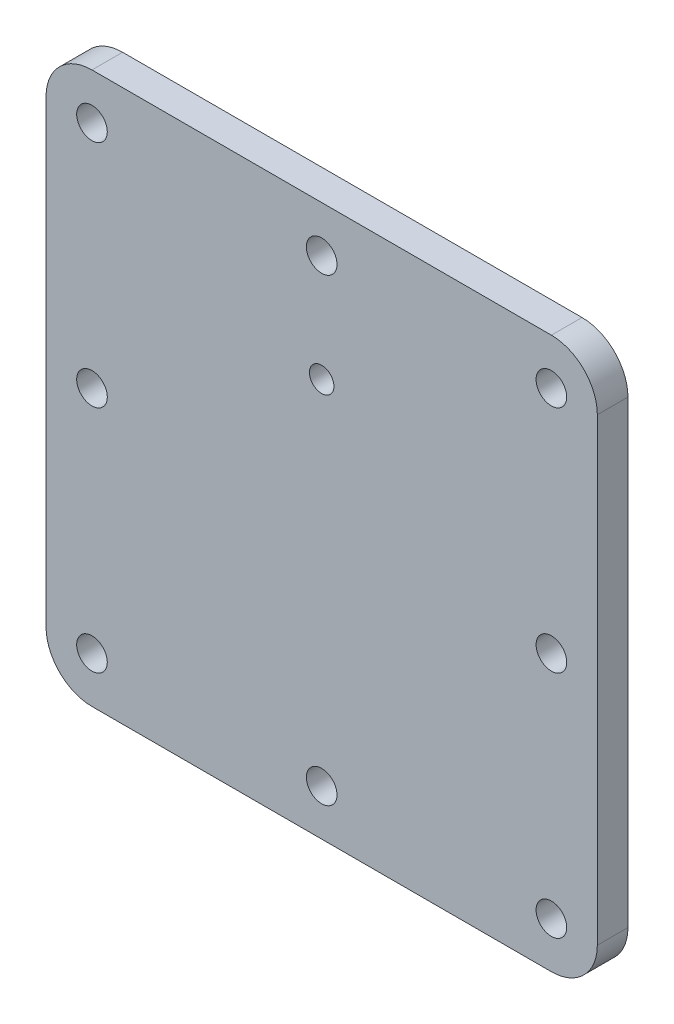
ISO-10303-21;
HEADER;
FILE_DESCRIPTION(('STEP AP214'),'2;1');
FILE_NAME('part.step','',(''),(''),'','','');
FILE_SCHEMA(('AUTOMOTIVE_DESIGN { 1 0 10303 214 1 1 1 1 }'));
ENDSEC;
DATA;
#1=APPLICATION_CONTEXT('core data for automotive mechanical design processes');
#2=APPLICATION_PROTOCOL_DEFINITION('international standard','automotive_design',2000,#1);
#3=PRODUCT_CONTEXT('',#1,'mechanical');
#4=PRODUCT('Part','Part','',(#3));
#5=PRODUCT_RELATED_PRODUCT_CATEGORY('part','',(#4));
#6=PRODUCT_DEFINITION_FORMATION('','',#4);
#7=PRODUCT_DEFINITION_CONTEXT('part definition',#1,'design');
#8=PRODUCT_DEFINITION('design','',#6,#7);
#9=PRODUCT_DEFINITION_SHAPE('','',#8);
#10=(LENGTH_UNIT() NAMED_UNIT(*) SI_UNIT(.MILLI.,.METRE.));
#11=(NAMED_UNIT(*) PLANE_ANGLE_UNIT() SI_UNIT($,.RADIAN.));
#12=(NAMED_UNIT(*) SI_UNIT($,.STERADIAN.) SOLID_ANGLE_UNIT());
#13=UNCERTAINTY_MEASURE_WITH_UNIT(LENGTH_MEASURE(1.E-05),#10,'distance_accuracy_value','');
#14=(GEOMETRIC_REPRESENTATION_CONTEXT(3) GLOBAL_UNCERTAINTY_ASSIGNED_CONTEXT((#13)) GLOBAL_UNIT_ASSIGNED_CONTEXT((#10,
#11,#12)) REPRESENTATION_CONTEXT('',''));
#15=CARTESIAN_POINT('',(0.,0.,0.));
#16=DIRECTION('',(0.,0.,1.));
#17=DIRECTION('',(1.,0.,0.));
#18=AXIS2_PLACEMENT_3D('',#15,#16,#17);
#19=CARTESIAN_POINT('',(-75.,-75.,10.));
#20=DIRECTION('',(0.,0.,1.));
#21=DIRECTION('',(1.,0.,0.));
#22=AXIS2_PLACEMENT_3D('',#19,#20,#21);
#23=PLANE('',#22);
#24=CARTESIAN_POINT('',(0.,40.,10.));
#25=DIRECTION('',(0.,0.,1.));
#26=DIRECTION('',(1.,0.,0.));
#27=AXIS2_PLACEMENT_3D('',#24,#25,#26);
#28=CIRCLE('',#27,4.);
#29=CARTESIAN_POINT('',(4.00000000000001,40.,10.));
#30=VERTEX_POINT('',#29);
#31=EDGE_CURVE('E227',#30,#30,#28,.T.);
#32=ORIENTED_EDGE('',*,*,#31,.F.);
#33=EDGE_LOOP('',(#32));
#34=FACE_BOUND('',#33,.T.);
#35=CARTESIAN_POINT('',(1.54341102686378E-12,-75.,10.));
#36=DIRECTION('',(0.,0.,1.));
#37=DIRECTION('',(1.,0.,0.));
#38=AXIS2_PLACEMENT_3D('',#35,#36,#37);
#39=CIRCLE('',#38,5.);
#40=CARTESIAN_POINT('',(5.00000000000154,-75.,10.));
#41=VERTEX_POINT('',#40);
#42=EDGE_CURVE('E212',#41,#41,#39,.T.);
#43=ORIENTED_EDGE('',*,*,#42,.F.);
#44=EDGE_LOOP('',(#43));
#45=FACE_BOUND('',#44,.T.);
#46=CARTESIAN_POINT('',(75.0000000000008,0.,10.));
#47=DIRECTION('',(0.,0.,1.));
#48=DIRECTION('',(1.,0.,0.));
#49=AXIS2_PLACEMENT_3D('',#46,#47,#48);
#50=CIRCLE('',#49,5.);
#51=CARTESIAN_POINT('',(80.0000000000008,0.,10.));
#52=VERTEX_POINT('',#51);
#53=EDGE_CURVE('E200',#52,#52,#50,.T.);
#54=ORIENTED_EDGE('',*,*,#53,.F.);
#55=EDGE_LOOP('',(#54));
#56=FACE_BOUND('',#55,.T.);
#57=CARTESIAN_POINT('',(75.,75.,10.));
#58=DIRECTION('',(0.,0.,1.));
#59=DIRECTION('',(1.,0.,0.));
#60=AXIS2_PLACEMENT_3D('',#57,#58,#59);
#61=CIRCLE('',#60,5.00000000000001);
#62=CARTESIAN_POINT('',(80.,75.,10.));
#63=VERTEX_POINT('',#62);
#64=EDGE_CURVE('E188',#63,#63,#61,.T.);
#65=ORIENTED_EDGE('',*,*,#64,.F.);
#66=EDGE_LOOP('',(#65));
#67=FACE_BOUND('',#66,.T.);
#68=CARTESIAN_POINT('',(-75.,75.,10.));
#69=DIRECTION('',(0.,0.,1.));
#70=DIRECTION('',(1.,0.,0.));
#71=AXIS2_PLACEMENT_3D('',#68,#69,#70);
#72=CIRCLE('',#71,5.00000000000001);
#73=CARTESIAN_POINT('',(-70.,75.,10.));
#74=VERTEX_POINT('',#73);
#75=EDGE_CURVE('E134',#74,#74,#72,.T.);
#76=ORIENTED_EDGE('',*,*,#75,.F.);
#77=EDGE_LOOP('',(#76));
#78=FACE_BOUND('',#77,.T.);
#79=CARTESIAN_POINT('',(-75.,-75.,10.));
#80=DIRECTION('',(0.,0.,1.));
#81=DIRECTION('',(1.,0.,0.));
#82=AXIS2_PLACEMENT_3D('',#79,#80,#81);
#83=CIRCLE('',#82,15.);
#84=CARTESIAN_POINT('',(-90.,-74.9999999999999,10.));
#85=VERTEX_POINT('',#84);
#86=CARTESIAN_POINT('',(-74.9999999999999,-90.,10.));
#87=VERTEX_POINT('',#86);
#88=EDGE_CURVE('E145',#85,#87,#83,.T.);
#89=ORIENTED_EDGE('',*,*,#88,.T.);
#90=DIRECTION('',(1.,0.,0.));
#91=VECTOR('',#90,1.);
#92=CARTESIAN_POINT('',(-74.9999999999999,-90.,10.));
#93=LINE('',#92,#91);
#94=CARTESIAN_POINT('',(75.,-89.9999999999992,10.));
#95=VERTEX_POINT('',#94);
#96=EDGE_CURVE('E93',#87,#95,#93,.T.);
#97=ORIENTED_EDGE('',*,*,#96,.T.);
#98=CARTESIAN_POINT('',(75.,-74.9999999999992,10.));
#99=DIRECTION('',(0.,0.,1.));
#100=DIRECTION('',(1.,0.,0.));
#101=AXIS2_PLACEMENT_3D('',#98,#99,#100);
#102=CIRCLE('',#101,15.);
#103=CARTESIAN_POINT('',(90.,-75.,10.));
#104=VERTEX_POINT('',#103);
#105=EDGE_CURVE('E160',#95,#104,#102,.T.);
#106=ORIENTED_EDGE('',*,*,#105,.T.);
#107=DIRECTION('',(0.,1.,0.));
#108=VECTOR('',#107,1.);
#109=CARTESIAN_POINT('',(90.,75.0000000000019,10.));
#110=LINE('',#109,#108);
#111=CARTESIAN_POINT('',(90.,75.0000000000019,10.));
#112=VERTEX_POINT('',#111);
#113=EDGE_CURVE('E173',#104,#112,#110,.T.);
#114=ORIENTED_EDGE('',*,*,#113,.T.);
#115=CARTESIAN_POINT('',(75.,75.,10.));
#116=DIRECTION('',(0.,0.,1.));
#117=DIRECTION('',(-1.,0.,0.));
#118=AXIS2_PLACEMENT_3D('',#115,#116,#117);
#119=CIRCLE('',#118,15.);
#120=CARTESIAN_POINT('',(74.9999999999999,90.,10.));
#121=VERTEX_POINT('',#120);
#122=EDGE_CURVE('E112',#112,#121,#119,.T.);
#123=ORIENTED_EDGE('',*,*,#122,.T.);
#124=DIRECTION('',(-1.,0.,0.));
#125=VECTOR('',#124,1.);
#126=CARTESIAN_POINT('',(-74.9999999999999,90.,10.));
#127=LINE('',#126,#125);
#128=CARTESIAN_POINT('',(-74.9999999999999,90.,10.));
#129=VERTEX_POINT('',#128);
#130=EDGE_CURVE('E106',#121,#129,#127,.T.);
#131=ORIENTED_EDGE('',*,*,#130,.T.);
#132=CARTESIAN_POINT('',(-75.,75.,10.));
#133=DIRECTION('',(0.,0.,1.));
#134=DIRECTION('',(1.,0.,0.));
#135=AXIS2_PLACEMENT_3D('',#132,#133,#134);
#136=CIRCLE('',#135,15.);
#137=CARTESIAN_POINT('',(-90.,74.9999999999999,10.));
#138=VERTEX_POINT('',#137);
#139=EDGE_CURVE('E110',#129,#138,#136,.T.);
#140=ORIENTED_EDGE('',*,*,#139,.T.);
#141=DIRECTION('',(0.,-1.,0.));
#142=VECTOR('',#141,1.);
#143=CARTESIAN_POINT('',(-90.,74.9999999999999,10.));
#144=LINE('',#143,#142);
#145=EDGE_CURVE('E50',#138,#85,#144,.T.);
#146=ORIENTED_EDGE('',*,*,#145,.T.);
#147=EDGE_LOOP('',(#89,#97,#106,#114,#123,#131,#140,#146));
#148=FACE_BOUND('',#147,.T.);
#149=CARTESIAN_POINT('',(0.,75.,10.));
#150=DIRECTION('',(0.,0.,1.));
#151=DIRECTION('',(1.,0.,0.));
#152=AXIS2_PLACEMENT_3D('',#149,#150,#151);
#153=CIRCLE('',#152,5.);
#154=CARTESIAN_POINT('',(4.99999999999997,75.,10.));
#155=VERTEX_POINT('',#154);
#156=EDGE_CURVE('E182',#155,#155,#153,.T.);
#157=ORIENTED_EDGE('',*,*,#156,.F.);
#158=EDGE_LOOP('',(#157));
#159=FACE_BOUND('',#158,.T.);
#160=CARTESIAN_POINT('',(-74.9999999999992,0.,10.));
#161=DIRECTION('',(0.,0.,1.));
#162=DIRECTION('',(1.,0.,0.));
#163=AXIS2_PLACEMENT_3D('',#160,#161,#162);
#164=CIRCLE('',#163,5.);
#165=CARTESIAN_POINT('',(-69.9999999999992,0.,10.));
#166=VERTEX_POINT('',#165);
#167=EDGE_CURVE('E194',#166,#166,#164,.T.);
#168=ORIENTED_EDGE('',*,*,#167,.F.);
#169=EDGE_LOOP('',(#168));
#170=FACE_BOUND('',#169,.T.);
#171=CARTESIAN_POINT('',(-74.9999999999985,-75.,10.));
#172=DIRECTION('',(0.,0.,1.));
#173=DIRECTION('',(1.,0.,0.));
#174=AXIS2_PLACEMENT_3D('',#171,#172,#173);
#175=CIRCLE('',#174,5.00000000000001);
#176=CARTESIAN_POINT('',(-69.9999999999985,-75.,10.));
#177=VERTEX_POINT('',#176);
#178=EDGE_CURVE('E206',#177,#177,#175,.T.);
#179=ORIENTED_EDGE('',*,*,#178,.F.);
#180=EDGE_LOOP('',(#179));
#181=FACE_BOUND('',#180,.T.);
#182=CARTESIAN_POINT('',(75.0000000000015,-75.,10.));
#183=DIRECTION('',(0.,0.,1.));
#184=DIRECTION('',(1.,0.,0.));
#185=AXIS2_PLACEMENT_3D('',#182,#183,#184);
#186=CIRCLE('',#185,5.00000000000001);
#187=CARTESIAN_POINT('',(80.0000000000015,-75.,10.));
#188=VERTEX_POINT('',#187);
#189=EDGE_CURVE('E218',#188,#188,#186,.T.);
#190=ORIENTED_EDGE('',*,*,#189,.F.);
#191=EDGE_LOOP('',(#190));
#192=FACE_BOUND('',#191,.T.);
#193=ADVANCED_FACE('F33',(#34,#45,#56,#67,#78,#148,#159,#170,#181,#192),#23,.T.);
#194=CARTESIAN_POINT('',(-75.,-75.,0.));
#195=DIRECTION('',(0.,0.,1.));
#196=DIRECTION('',(1.,0.,0.));
#197=AXIS2_PLACEMENT_3D('',#194,#195,#196);
#198=PLANE('',#197);
#199=CARTESIAN_POINT('',(0.,40.,0.));
#200=DIRECTION('',(0.,0.,1.));
#201=DIRECTION('',(1.,0.,0.));
#202=AXIS2_PLACEMENT_3D('',#199,#200,#201);
#203=CIRCLE('',#202,4.);
#204=CARTESIAN_POINT('',(4.00000000000001,40.,0.));
#205=VERTEX_POINT('',#204);
#206=EDGE_CURVE('E224',#205,#205,#203,.T.);
#207=ORIENTED_EDGE('',*,*,#206,.T.);
#208=EDGE_LOOP('',(#207));
#209=FACE_BOUND('',#208,.T.);
#210=CARTESIAN_POINT('',(-75.,-75.,0.));
#211=DIRECTION('',(0.,0.,1.));
#212=DIRECTION('',(1.,0.,0.));
#213=AXIS2_PLACEMENT_3D('',#210,#211,#212);
#214=CIRCLE('',#213,15.);
#215=CARTESIAN_POINT('',(-90.,-74.9999999999999,0.));
#216=VERTEX_POINT('',#215);
#217=CARTESIAN_POINT('',(-74.9999999999999,-90.,0.));
#218=VERTEX_POINT('',#217);
#219=EDGE_CURVE('E130',#216,#218,#214,.T.);
#220=ORIENTED_EDGE('',*,*,#219,.F.);
#221=DIRECTION('',(0.,-1.,0.));
#222=VECTOR('',#221,1.);
#223=CARTESIAN_POINT('',(-90.,74.9999999999999,0.));
#224=LINE('',#223,#222);
#225=CARTESIAN_POINT('',(-90.,74.9999999999999,0.));
#226=VERTEX_POINT('',#225);
#227=EDGE_CURVE('E85',#226,#216,#224,.T.);
#228=ORIENTED_EDGE('',*,*,#227,.F.);
#229=CARTESIAN_POINT('',(-75.,75.,0.));
#230=DIRECTION('',(0.,0.,1.));
#231=DIRECTION('',(1.,0.,0.));
#232=AXIS2_PLACEMENT_3D('',#229,#230,#231);
#233=CIRCLE('',#232,15.);
#234=CARTESIAN_POINT('',(-74.9999999999999,90.,0.));
#235=VERTEX_POINT('',#234);
#236=EDGE_CURVE('E79',#235,#226,#233,.T.);
#237=ORIENTED_EDGE('',*,*,#236,.F.);
#238=DIRECTION('',(-1.,0.,0.));
#239=VECTOR('',#238,1.);
#240=CARTESIAN_POINT('',(-74.9999999999999,90.,0.));
#241=LINE('',#240,#239);
#242=CARTESIAN_POINT('',(74.9999999999999,90.,0.));
#243=VERTEX_POINT('',#242);
#244=EDGE_CURVE('E120',#243,#235,#241,.T.);
#245=ORIENTED_EDGE('',*,*,#244,.F.);
#246=CARTESIAN_POINT('',(75.,75.,0.));
#247=DIRECTION('',(0.,0.,1.));
#248=DIRECTION('',(-1.,0.,0.));
#249=AXIS2_PLACEMENT_3D('',#246,#247,#248);
#250=CIRCLE('',#249,15.);
#251=CARTESIAN_POINT('',(90.,75.0000000000019,0.));
#252=VERTEX_POINT('',#251);
#253=EDGE_CURVE('E140',#252,#243,#250,.T.);
#254=ORIENTED_EDGE('',*,*,#253,.F.);
#255=DIRECTION('',(0.,1.,0.));
#256=VECTOR('',#255,1.);
#257=CARTESIAN_POINT('',(90.,75.0000000000019,0.));
#258=LINE('',#257,#256);
#259=CARTESIAN_POINT('',(90.,-75.,0.));
#260=VERTEX_POINT('',#259);
#261=EDGE_CURVE('E138',#260,#252,#258,.T.);
#262=ORIENTED_EDGE('',*,*,#261,.F.);
#263=CARTESIAN_POINT('',(75.,-74.9999999999992,0.));
#264=DIRECTION('',(0.,0.,1.));
#265=DIRECTION('',(1.,0.,0.));
#266=AXIS2_PLACEMENT_3D('',#263,#264,#265);
#267=CIRCLE('',#266,15.);
#268=CARTESIAN_POINT('',(75.,-89.9999999999992,0.));
#269=VERTEX_POINT('',#268);
#270=EDGE_CURVE('E136',#269,#260,#267,.T.);
#271=ORIENTED_EDGE('',*,*,#270,.F.);
#272=DIRECTION('',(1.,0.,0.));
#273=VECTOR('',#272,1.);
#274=CARTESIAN_POINT('',(-74.9999999999999,-90.,0.));
#275=LINE('',#274,#273);
#276=EDGE_CURVE('E133',#218,#269,#275,.T.);
#277=ORIENTED_EDGE('',*,*,#276,.F.);
#278=EDGE_LOOP('',(#220,#228,#237,#245,#254,#262,#271,#277));
#279=FACE_BOUND('',#278,.T.);
#280=CARTESIAN_POINT('',(-75.,75.,0.));
#281=DIRECTION('',(0.,0.,1.));
#282=DIRECTION('',(1.,0.,0.));
#283=AXIS2_PLACEMENT_3D('',#280,#281,#282);
#284=CIRCLE('',#283,5.00000000000001);
#285=CARTESIAN_POINT('',(-70.,75.,0.));
#286=VERTEX_POINT('',#285);
#287=EDGE_CURVE('E179',#286,#286,#284,.T.);
#288=ORIENTED_EDGE('',*,*,#287,.T.);
#289=EDGE_LOOP('',(#288));
#290=FACE_BOUND('',#289,.T.);
#291=CARTESIAN_POINT('',(0.,75.,0.));
#292=DIRECTION('',(0.,0.,1.));
#293=DIRECTION('',(1.,0.,0.));
#294=AXIS2_PLACEMENT_3D('',#291,#292,#293);
#295=CIRCLE('',#294,5.);
#296=CARTESIAN_POINT('',(4.99999999999997,75.,0.));
#297=VERTEX_POINT('',#296);
#298=EDGE_CURVE('E185',#297,#297,#295,.T.);
#299=ORIENTED_EDGE('',*,*,#298,.T.);
#300=EDGE_LOOP('',(#299));
#301=FACE_BOUND('',#300,.T.);
#302=CARTESIAN_POINT('',(75.,75.,0.));
#303=DIRECTION('',(0.,0.,1.));
#304=DIRECTION('',(1.,0.,0.));
#305=AXIS2_PLACEMENT_3D('',#302,#303,#304);
#306=CIRCLE('',#305,5.00000000000001);
#307=CARTESIAN_POINT('',(80.,75.,0.));
#308=VERTEX_POINT('',#307);
#309=EDGE_CURVE('E191',#308,#308,#306,.T.);
#310=ORIENTED_EDGE('',*,*,#309,.T.);
#311=EDGE_LOOP('',(#310));
#312=FACE_BOUND('',#311,.T.);
#313=CARTESIAN_POINT('',(-74.9999999999992,0.,0.));
#314=DIRECTION('',(0.,0.,1.));
#315=DIRECTION('',(1.,0.,0.));
#316=AXIS2_PLACEMENT_3D('',#313,#314,#315);
#317=CIRCLE('',#316,5.);
#318=CARTESIAN_POINT('',(-69.9999999999992,0.,0.));
#319=VERTEX_POINT('',#318);
#320=EDGE_CURVE('E197',#319,#319,#317,.T.);
#321=ORIENTED_EDGE('',*,*,#320,.T.);
#322=EDGE_LOOP('',(#321));
#323=FACE_BOUND('',#322,.T.);
#324=CARTESIAN_POINT('',(75.0000000000008,0.,0.));
#325=DIRECTION('',(0.,0.,1.));
#326=DIRECTION('',(1.,0.,0.));
#327=AXIS2_PLACEMENT_3D('',#324,#325,#326);
#328=CIRCLE('',#327,5.);
#329=CARTESIAN_POINT('',(80.0000000000008,0.,0.));
#330=VERTEX_POINT('',#329);
#331=EDGE_CURVE('E203',#330,#330,#328,.T.);
#332=ORIENTED_EDGE('',*,*,#331,.T.);
#333=EDGE_LOOP('',(#332));
#334=FACE_BOUND('',#333,.T.);
#335=CARTESIAN_POINT('',(-74.9999999999985,-75.,0.));
#336=DIRECTION('',(0.,0.,1.));
#337=DIRECTION('',(1.,0.,0.));
#338=AXIS2_PLACEMENT_3D('',#335,#336,#337);
#339=CIRCLE('',#338,5.00000000000001);
#340=CARTESIAN_POINT('',(-69.9999999999985,-75.,0.));
#341=VERTEX_POINT('',#340);
#342=EDGE_CURVE('E209',#341,#341,#339,.T.);
#343=ORIENTED_EDGE('',*,*,#342,.T.);
#344=EDGE_LOOP('',(#343));
#345=FACE_BOUND('',#344,.T.);
#346=CARTESIAN_POINT('',(1.54341102686378E-12,-75.,0.));
#347=DIRECTION('',(0.,0.,1.));
#348=DIRECTION('',(1.,0.,0.));
#349=AXIS2_PLACEMENT_3D('',#346,#347,#348);
#350=CIRCLE('',#349,5.);
#351=CARTESIAN_POINT('',(5.00000000000154,-75.,0.));
#352=VERTEX_POINT('',#351);
#353=EDGE_CURVE('E215',#352,#352,#350,.T.);
#354=ORIENTED_EDGE('',*,*,#353,.T.);
#355=EDGE_LOOP('',(#354));
#356=FACE_BOUND('',#355,.T.);
#357=CARTESIAN_POINT('',(75.0000000000015,-75.,0.));
#358=DIRECTION('',(0.,0.,1.));
#359=DIRECTION('',(1.,0.,0.));
#360=AXIS2_PLACEMENT_3D('',#357,#358,#359);
#361=CIRCLE('',#360,5.00000000000001);
#362=CARTESIAN_POINT('',(80.0000000000015,-75.,0.));
#363=VERTEX_POINT('',#362);
#364=EDGE_CURVE('E221',#363,#363,#361,.T.);
#365=ORIENTED_EDGE('',*,*,#364,.T.);
#366=EDGE_LOOP('',(#365));
#367=FACE_BOUND('',#366,.T.);
#368=ADVANCED_FACE('F164',(#209,#279,#290,#301,#312,#323,#334,#345,#356,#367),#198,.F.);
#369=CARTESIAN_POINT('',(-75.,-75.,10.));
#370=DIRECTION('',(0.,0.,-1.));
#371=DIRECTION('',(-1.,0.,0.));
#372=AXIS2_PLACEMENT_3D('',#369,#370,#371);
#373=CYLINDRICAL_SURFACE('',#372,15.);
#374=ORIENTED_EDGE('',*,*,#219,.T.);
#375=DIRECTION('',(0.,0.,-1.));
#376=VECTOR('',#375,1.);
#377=CARTESIAN_POINT('',(-74.9999999999999,-90.,10.));
#378=LINE('',#377,#376);
#379=EDGE_CURVE('E11',#87,#218,#378,.T.);
#380=ORIENTED_EDGE('',*,*,#379,.F.);
#381=ORIENTED_EDGE('',*,*,#88,.F.);
#382=DIRECTION('',(0.,0.,-1.));
#383=VECTOR('',#382,1.);
#384=CARTESIAN_POINT('',(-90.,-74.9999999999999,10.));
#385=LINE('',#384,#383);
#386=EDGE_CURVE('E126',#85,#216,#385,.T.);
#387=ORIENTED_EDGE('',*,*,#386,.T.);
#388=EDGE_LOOP('',(#374,#380,#381,#387));
#389=FACE_BOUND('',#388,.T.);
#390=ADVANCED_FACE('F35',(#389),#373,.T.);
#391=CARTESIAN_POINT('',(-74.9999999999999,-90.,10.));
#392=DIRECTION('',(0.,1.,0.));
#393=DIRECTION('',(-1.,0.,0.));
#394=AXIS2_PLACEMENT_3D('',#391,#392,#393);
#395=PLANE('',#394);
#396=ORIENTED_EDGE('',*,*,#276,.T.);
#397=DIRECTION('',(0.,0.,-1.));
#398=VECTOR('',#397,1.);
#399=CARTESIAN_POINT('',(75.,-89.9999999999992,10.));
#400=LINE('',#399,#398);
#401=EDGE_CURVE('E42',#95,#269,#400,.T.);
#402=ORIENTED_EDGE('',*,*,#401,.F.);
#403=ORIENTED_EDGE('',*,*,#96,.F.);
#404=ORIENTED_EDGE('',*,*,#379,.T.);
#405=EDGE_LOOP('',(#396,#402,#403,#404));
#406=FACE_BOUND('',#405,.T.);
#407=ADVANCED_FACE('F316',(#406),#395,.F.);
#408=CARTESIAN_POINT('',(75.,-74.9999999999992,10.));
#409=DIRECTION('',(0.,0.,-1.));
#410=DIRECTION('',(-1.,0.,0.));
#411=AXIS2_PLACEMENT_3D('',#408,#409,#410);
#412=CYLINDRICAL_SURFACE('',#411,15.);
#413=ORIENTED_EDGE('',*,*,#270,.T.);
#414=DIRECTION('',(0.,0.,-1.));
#415=VECTOR('',#414,1.);
#416=CARTESIAN_POINT('',(90.,-75.,10.));
#417=LINE('',#416,#415);
#418=EDGE_CURVE('E152',#104,#260,#417,.T.);
#419=ORIENTED_EDGE('',*,*,#418,.F.);
#420=ORIENTED_EDGE('',*,*,#105,.F.);
#421=ORIENTED_EDGE('',*,*,#401,.T.);
#422=EDGE_LOOP('',(#413,#419,#420,#421));
#423=FACE_BOUND('',#422,.T.);
#424=ADVANCED_FACE('F158',(#423),#412,.T.);
#425=CARTESIAN_POINT('',(90.,75.0000000000019,10.));
#426=DIRECTION('',(-1.,0.,0.));
#427=DIRECTION('',(0.,-1.,0.));
#428=AXIS2_PLACEMENT_3D('',#425,#426,#427);
#429=PLANE('',#428);
#430=ORIENTED_EDGE('',*,*,#261,.T.);
#431=DIRECTION('',(0.,0.,-1.));
#432=VECTOR('',#431,1.);
#433=CARTESIAN_POINT('',(90.,75.0000000000019,10.));
#434=LINE('',#433,#432);
#435=EDGE_CURVE('E149',#112,#252,#434,.T.);
#436=ORIENTED_EDGE('',*,*,#435,.F.);
#437=ORIENTED_EDGE('',*,*,#113,.F.);
#438=ORIENTED_EDGE('',*,*,#418,.T.);
#439=EDGE_LOOP('',(#430,#436,#437,#438));
#440=FACE_BOUND('',#439,.T.);
#441=ADVANCED_FACE('F169',(#440),#429,.F.);
#442=CARTESIAN_POINT('',(75.,75.,10.));
#443=DIRECTION('',(0.,0.,-1.));
#444=DIRECTION('',(-1.,0.,0.));
#445=AXIS2_PLACEMENT_3D('',#442,#443,#444);
#446=CYLINDRICAL_SURFACE('',#445,15.);
#447=ORIENTED_EDGE('',*,*,#253,.T.);
#448=DIRECTION('',(0.,0.,-1.));
#449=VECTOR('',#448,1.);
#450=CARTESIAN_POINT('',(74.9999999999999,90.,10.));
#451=LINE('',#450,#449);
#452=EDGE_CURVE('E121',#121,#243,#451,.T.);
#453=ORIENTED_EDGE('',*,*,#452,.F.);
#454=ORIENTED_EDGE('',*,*,#122,.F.);
#455=ORIENTED_EDGE('',*,*,#435,.T.);
#456=EDGE_LOOP('',(#447,#453,#454,#455));
#457=FACE_BOUND('',#456,.T.);
#458=ADVANCED_FACE('F172',(#457),#446,.T.);
#459=CARTESIAN_POINT('',(-74.9999999999999,90.,10.));
#460=DIRECTION('',(0.,-1.,0.));
#461=DIRECTION('',(0.,0.,-1.));
#462=AXIS2_PLACEMENT_3D('',#459,#460,#461);
#463=PLANE('',#462);
#464=ORIENTED_EDGE('',*,*,#244,.T.);
#465=DIRECTION('',(0.,0.,-1.));
#466=VECTOR('',#465,1.);
#467=CARTESIAN_POINT('',(-74.9999999999999,90.,10.));
#468=LINE('',#467,#466);
#469=EDGE_CURVE('E117',#129,#235,#468,.T.);
#470=ORIENTED_EDGE('',*,*,#469,.F.);
#471=ORIENTED_EDGE('',*,*,#130,.F.);
#472=ORIENTED_EDGE('',*,*,#452,.T.);
#473=EDGE_LOOP('',(#464,#470,#471,#472));
#474=FACE_BOUND('',#473,.T.);
#475=ADVANCED_FACE('F118',(#474),#463,.F.);
#476=CARTESIAN_POINT('',(-75.,75.,10.));
#477=DIRECTION('',(0.,0.,-1.));
#478=DIRECTION('',(-1.,0.,0.));
#479=AXIS2_PLACEMENT_3D('',#476,#477,#478);
#480=CYLINDRICAL_SURFACE('',#479,15.);
#481=ORIENTED_EDGE('',*,*,#236,.T.);
#482=DIRECTION('',(0.,0.,-1.));
#483=VECTOR('',#482,1.);
#484=CARTESIAN_POINT('',(-90.,74.9999999999999,10.));
#485=LINE('',#484,#483);
#486=EDGE_CURVE('E122',#138,#226,#485,.T.);
#487=ORIENTED_EDGE('',*,*,#486,.F.);
#488=ORIENTED_EDGE('',*,*,#139,.F.);
#489=ORIENTED_EDGE('',*,*,#469,.T.);
#490=EDGE_LOOP('',(#481,#487,#488,#489));
#491=FACE_BOUND('',#490,.T.);
#492=ADVANCED_FACE('F124',(#491),#480,.T.);
#493=CARTESIAN_POINT('',(-90.,74.9999999999999,10.));
#494=DIRECTION('',(1.,0.,0.));
#495=DIRECTION('',(0.,1.,0.));
#496=AXIS2_PLACEMENT_3D('',#493,#494,#495);
#497=PLANE('',#496);
#498=ORIENTED_EDGE('',*,*,#227,.T.);
#499=ORIENTED_EDGE('',*,*,#386,.F.);
#500=ORIENTED_EDGE('',*,*,#145,.F.);
#501=ORIENTED_EDGE('',*,*,#486,.T.);
#502=EDGE_LOOP('',(#498,#499,#500,#501));
#503=FACE_BOUND('',#502,.T.);
#504=ADVANCED_FACE('F256',(#503),#497,.F.);
#505=CARTESIAN_POINT('',(-75.,75.,10.));
#506=DIRECTION('',(0.,0.,-1.));
#507=DIRECTION('',(-1.,0.,0.));
#508=AXIS2_PLACEMENT_3D('',#505,#506,#507);
#509=CYLINDRICAL_SURFACE('',#508,5.00000000000001);
#510=ORIENTED_EDGE('',*,*,#75,.T.);
#511=EDGE_LOOP('',(#510));
#512=FACE_BOUND('',#511,.T.);
#513=ORIENTED_EDGE('',*,*,#287,.F.);
#514=EDGE_LOOP('',(#513));
#515=FACE_BOUND('',#514,.T.);
#516=ADVANCED_FACE('F252',(#512,#515),#509,.F.);
#517=CARTESIAN_POINT('',(0.,75.,10.));
#518=DIRECTION('',(0.,0.,-1.));
#519=DIRECTION('',(-1.,0.,0.));
#520=AXIS2_PLACEMENT_3D('',#517,#518,#519);
#521=CYLINDRICAL_SURFACE('',#520,5.);
#522=ORIENTED_EDGE('',*,*,#156,.T.);
#523=EDGE_LOOP('',(#522));
#524=FACE_BOUND('',#523,.T.);
#525=ORIENTED_EDGE('',*,*,#298,.F.);
#526=EDGE_LOOP('',(#525));
#527=FACE_BOUND('',#526,.T.);
#528=ADVANCED_FACE('F255',(#524,#527),#521,.F.);
#529=CARTESIAN_POINT('',(75.,75.,10.));
#530=DIRECTION('',(0.,0.,-1.));
#531=DIRECTION('',(-1.,0.,0.));
#532=AXIS2_PLACEMENT_3D('',#529,#530,#531);
#533=CYLINDRICAL_SURFACE('',#532,5.00000000000001);
#534=ORIENTED_EDGE('',*,*,#64,.T.);
#535=EDGE_LOOP('',(#534));
#536=FACE_BOUND('',#535,.T.);
#537=ORIENTED_EDGE('',*,*,#309,.F.);
#538=EDGE_LOOP('',(#537));
#539=FACE_BOUND('',#538,.T.);
#540=ADVANCED_FACE('F297',(#536,#539),#533,.F.);
#541=CARTESIAN_POINT('',(-74.9999999999992,0.,10.));
#542=DIRECTION('',(0.,0.,-1.));
#543=DIRECTION('',(-1.,0.,0.));
#544=AXIS2_PLACEMENT_3D('',#541,#542,#543);
#545=CYLINDRICAL_SURFACE('',#544,5.);
#546=ORIENTED_EDGE('',*,*,#167,.T.);
#547=EDGE_LOOP('',(#546));
#548=FACE_BOUND('',#547,.T.);
#549=ORIENTED_EDGE('',*,*,#320,.F.);
#550=EDGE_LOOP('',(#549));
#551=FACE_BOUND('',#550,.T.);
#552=ADVANCED_FACE('F293',(#548,#551),#545,.F.);
#553=CARTESIAN_POINT('',(75.0000000000008,0.,10.));
#554=DIRECTION('',(0.,0.,-1.));
#555=DIRECTION('',(-1.,0.,0.));
#556=AXIS2_PLACEMENT_3D('',#553,#554,#555);
#557=CYLINDRICAL_SURFACE('',#556,5.);
#558=ORIENTED_EDGE('',*,*,#53,.T.);
#559=EDGE_LOOP('',(#558));
#560=FACE_BOUND('',#559,.T.);
#561=ORIENTED_EDGE('',*,*,#331,.F.);
#562=EDGE_LOOP('',(#561));
#563=FACE_BOUND('',#562,.T.);
#564=ADVANCED_FACE('F289',(#560,#563),#557,.F.);
#565=CARTESIAN_POINT('',(-74.9999999999985,-75.,10.));
#566=DIRECTION('',(0.,0.,-1.));
#567=DIRECTION('',(-1.,0.,0.));
#568=AXIS2_PLACEMENT_3D('',#565,#566,#567);
#569=CYLINDRICAL_SURFACE('',#568,5.00000000000001);
#570=ORIENTED_EDGE('',*,*,#178,.T.);
#571=EDGE_LOOP('',(#570));
#572=FACE_BOUND('',#571,.T.);
#573=ORIENTED_EDGE('',*,*,#342,.F.);
#574=EDGE_LOOP('',(#573));
#575=FACE_BOUND('',#574,.T.);
#576=ADVANCED_FACE('F283',(#572,#575),#569,.F.);
#577=CARTESIAN_POINT('',(1.54341102686378E-12,-75.,10.));
#578=DIRECTION('',(0.,0.,-1.));
#579=DIRECTION('',(-1.,0.,0.));
#580=AXIS2_PLACEMENT_3D('',#577,#578,#579);
#581=CYLINDRICAL_SURFACE('',#580,5.);
#582=ORIENTED_EDGE('',*,*,#42,.T.);
#583=EDGE_LOOP('',(#582));
#584=FACE_BOUND('',#583,.T.);
#585=ORIENTED_EDGE('',*,*,#353,.F.);
#586=EDGE_LOOP('',(#585));
#587=FACE_BOUND('',#586,.T.);
#588=ADVANCED_FACE('F277',(#584,#587),#581,.F.);
#589=CARTESIAN_POINT('',(75.0000000000015,-75.,10.));
#590=DIRECTION('',(0.,0.,-1.));
#591=DIRECTION('',(-1.,0.,0.));
#592=AXIS2_PLACEMENT_3D('',#589,#590,#591);
#593=CYLINDRICAL_SURFACE('',#592,5.00000000000001);
#594=ORIENTED_EDGE('',*,*,#189,.T.);
#595=EDGE_LOOP('',(#594));
#596=FACE_BOUND('',#595,.T.);
#597=ORIENTED_EDGE('',*,*,#364,.F.);
#598=EDGE_LOOP('',(#597));
#599=FACE_BOUND('',#598,.T.);
#600=ADVANCED_FACE('F237',(#596,#599),#593,.F.);
#601=CARTESIAN_POINT('',(0.,40.,0.));
#602=DIRECTION('',(0.,0.,1.));
#603=DIRECTION('',(1.,0.,0.));
#604=AXIS2_PLACEMENT_3D('',#601,#602,#603);
#605=CYLINDRICAL_SURFACE('',#604,4.);
#606=ORIENTED_EDGE('',*,*,#206,.F.);
#607=EDGE_LOOP('',(#606));
#608=FACE_BOUND('',#607,.T.);
#609=ORIENTED_EDGE('',*,*,#31,.T.);
#610=EDGE_LOOP('',(#609));
#611=FACE_BOUND('',#610,.T.);
#612=ADVANCED_FACE('F234',(#608,#611),#605,.F.);
#613=CLOSED_SHELL('',(#193,#368,#390,#407,#424,#441,#458,#475,#492,#504,#516,#528,#540,#552,
#564,#576,#588,#600,#612));
#614=MANIFOLD_SOLID_BREP('B2',#613);
#615=ADVANCED_BREP_SHAPE_REPRESENTATION('',(#18,#614),#14);
#616=SHAPE_DEFINITION_REPRESENTATION(#9,#615);
ENDSEC;
END-ISO-10303-21;
